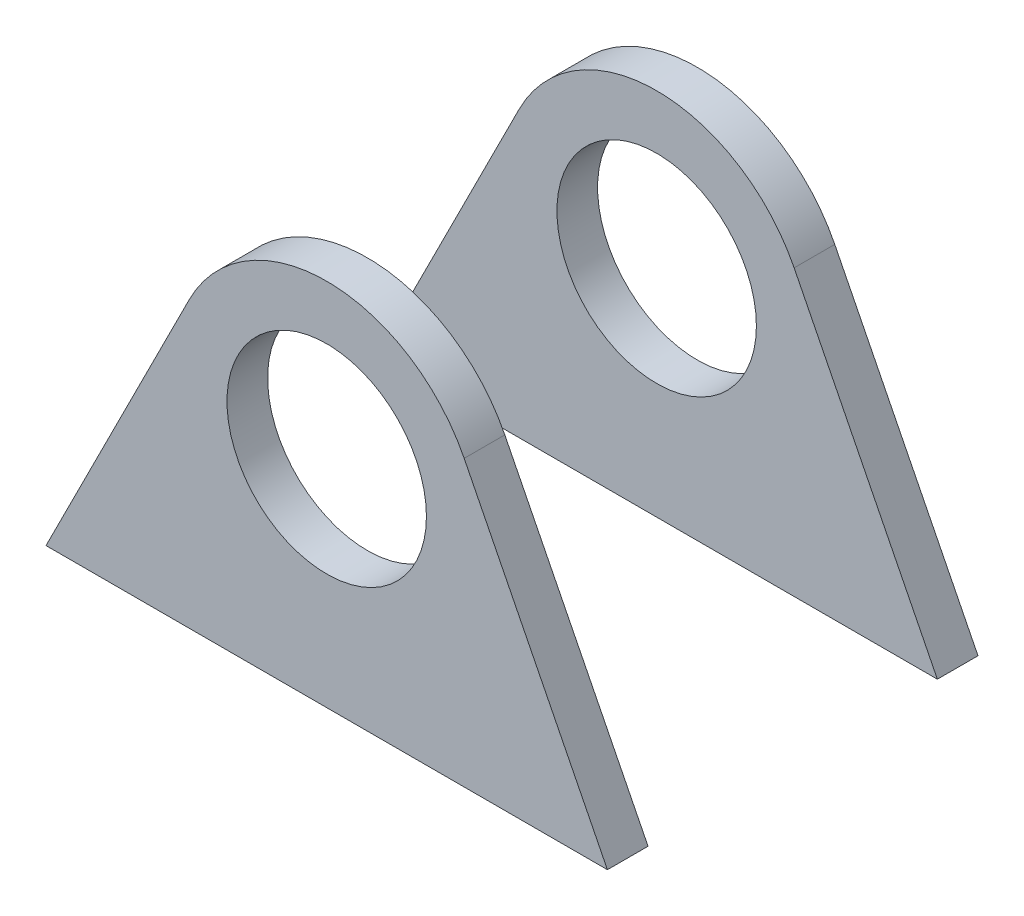
ISO-10303-21;
HEADER;
FILE_DESCRIPTION(('STEP AP214'),'2;1');
FILE_NAME('part.step','',(''),(''),'','','');
FILE_SCHEMA(('AUTOMOTIVE_DESIGN { 1 0 10303 214 1 1 1 1 }'));
ENDSEC;
DATA;
#1=APPLICATION_CONTEXT('core data for automotive mechanical design processes');
#2=APPLICATION_PROTOCOL_DEFINITION('international standard','automotive_design',2000,#1);
#3=PRODUCT_CONTEXT('',#1,'mechanical');
#4=PRODUCT('Part','Part','',(#3));
#5=PRODUCT_RELATED_PRODUCT_CATEGORY('part','',(#4));
#6=PRODUCT_DEFINITION_FORMATION('','',#4);
#7=PRODUCT_DEFINITION_CONTEXT('part definition',#1,'design');
#8=PRODUCT_DEFINITION('design','',#6,#7);
#9=PRODUCT_DEFINITION_SHAPE('','',#8);
#10=(LENGTH_UNIT() NAMED_UNIT(*) SI_UNIT(.MILLI.,.METRE.));
#11=(NAMED_UNIT(*) PLANE_ANGLE_UNIT() SI_UNIT($,.RADIAN.));
#12=(NAMED_UNIT(*) SI_UNIT($,.STERADIAN.) SOLID_ANGLE_UNIT());
#13=UNCERTAINTY_MEASURE_WITH_UNIT(LENGTH_MEASURE(1.E-05),#10,'distance_accuracy_value','');
#14=(GEOMETRIC_REPRESENTATION_CONTEXT(3) GLOBAL_UNCERTAINTY_ASSIGNED_CONTEXT((#13)) GLOBAL_UNIT_ASSIGNED_CONTEXT((#10,
#11,#12)) REPRESENTATION_CONTEXT('',''));
#15=CARTESIAN_POINT('',(0.,0.,0.));
#16=DIRECTION('',(0.,0.,1.));
#17=DIRECTION('',(1.,0.,0.));
#18=AXIS2_PLACEMENT_3D('',#15,#16,#17);
#19=CARTESIAN_POINT('',(0.,0.,26.8));
#20=DIRECTION('',(0.,0.,1.));
#21=DIRECTION('',(-1.,0.,0.));
#22=AXIS2_PLACEMENT_3D('',#19,#20,#21);
#23=PLANE('',#22);
#24=DIRECTION('',(-0.449518691350352,0.893270925378559,0.));
#25=VECTOR('',#24,1.);
#26=CARTESIAN_POINT('',(22.8,-17.5,26.8));
#27=LINE('',#26,#25);
#28=CARTESIAN_POINT('',(22.8,-17.5,26.8));
#29=VERTEX_POINT('',#28);
#30=CARTESIAN_POINT('',(11.165886567232,5.6189836418794,26.8));
#31=VERTEX_POINT('',#30);
#32=EDGE_CURVE('E101',#29,#31,#27,.T.);
#33=ORIENTED_EDGE('',*,*,#32,.F.);
#34=DIRECTION('',(1.,0.,0.));
#35=VECTOR('',#34,1.);
#36=CARTESIAN_POINT('',(-22.8,-17.5,26.8));
#37=LINE('',#36,#35);
#38=CARTESIAN_POINT('',(-22.8,-17.5,26.8));
#39=VERTEX_POINT('',#38);
#40=EDGE_CURVE('E104',#39,#29,#37,.T.);
#41=ORIENTED_EDGE('',*,*,#40,.F.);
#42=DIRECTION('',(-0.449518691350352,-0.893270925378559,0.));
#43=VECTOR('',#42,1.);
#44=CARTESIAN_POINT('',(-22.8,-17.5,26.8));
#45=LINE('',#44,#43);
#46=CARTESIAN_POINT('',(-11.165886567232,5.61898364187939,26.8));
#47=VERTEX_POINT('',#46);
#48=EDGE_CURVE('E92',#47,#39,#45,.T.);
#49=ORIENTED_EDGE('',*,*,#48,.F.);
#50=CARTESIAN_POINT('',(0.,0.,26.8));
#51=DIRECTION('',(0.,0.,1.));
#52=DIRECTION('',(-1.,0.,0.));
#53=AXIS2_PLACEMENT_3D('',#50,#51,#52);
#54=CIRCLE('',#53,12.5);
#55=EDGE_CURVE('E97',#31,#47,#54,.T.);
#56=ORIENTED_EDGE('',*,*,#55,.F.);
#57=EDGE_LOOP('',(#33,#41,#49,#56));
#58=FACE_BOUND('',#57,.T.);
#59=CARTESIAN_POINT('',(0.,0.,26.8));
#60=DIRECTION('',(0.,0.,1.));
#61=DIRECTION('',(1.,0.,0.));
#62=AXIS2_PLACEMENT_3D('',#59,#60,#61);
#63=CIRCLE('',#62,8.1);
#64=CARTESIAN_POINT('',(8.1,0.,26.8));
#65=VERTEX_POINT('',#64);
#66=EDGE_CURVE('E113',#65,#65,#63,.T.);
#67=ORIENTED_EDGE('',*,*,#66,.T.);
#68=EDGE_LOOP('',(#67));
#69=FACE_BOUND('',#68,.T.);
#70=ADVANCED_FACE('F45',(#58,#69),#23,.F.);
#71=CARTESIAN_POINT('',(0.,0.,30.1));
#72=DIRECTION('',(0.,0.,1.));
#73=DIRECTION('',(-1.,0.,0.));
#74=AXIS2_PLACEMENT_3D('',#71,#72,#73);
#75=PLANE('',#74);
#76=DIRECTION('',(-0.449518691350352,0.893270925378559,0.));
#77=VECTOR('',#76,1.);
#78=CARTESIAN_POINT('',(22.8,-17.5,30.1));
#79=LINE('',#78,#77);
#80=CARTESIAN_POINT('',(22.8,-17.5,30.1));
#81=VERTEX_POINT('',#80);
#82=CARTESIAN_POINT('',(11.165886567232,5.6189836418794,30.1));
#83=VERTEX_POINT('',#82);
#84=EDGE_CURVE('E109',#81,#83,#79,.T.);
#85=ORIENTED_EDGE('',*,*,#84,.T.);
#86=CARTESIAN_POINT('',(0.,0.,30.1));
#87=DIRECTION('',(0.,0.,1.));
#88=DIRECTION('',(-1.,0.,0.));
#89=AXIS2_PLACEMENT_3D('',#86,#87,#88);
#90=CIRCLE('',#89,12.5);
#91=CARTESIAN_POINT('',(-11.165886567232,5.61898364187939,30.1));
#92=VERTEX_POINT('',#91);
#93=EDGE_CURVE('E112',#83,#92,#90,.T.);
#94=ORIENTED_EDGE('',*,*,#93,.T.);
#95=DIRECTION('',(-0.449518691350352,-0.893270925378559,0.));
#96=VECTOR('',#95,1.);
#97=CARTESIAN_POINT('',(-22.8,-17.5,30.1));
#98=LINE('',#97,#96);
#99=CARTESIAN_POINT('',(-22.8,-17.5,30.1));
#100=VERTEX_POINT('',#99);
#101=EDGE_CURVE('E95',#92,#100,#98,.T.);
#102=ORIENTED_EDGE('',*,*,#101,.T.);
#103=DIRECTION('',(1.,0.,0.));
#104=VECTOR('',#103,1.);
#105=CARTESIAN_POINT('',(-22.8,-17.5,30.1));
#106=LINE('',#105,#104);
#107=EDGE_CURVE('E116',#100,#81,#106,.T.);
#108=ORIENTED_EDGE('',*,*,#107,.T.);
#109=EDGE_LOOP('',(#85,#94,#102,#108));
#110=FACE_BOUND('',#109,.T.);
#111=CARTESIAN_POINT('',(0.,0.,30.1));
#112=DIRECTION('',(0.,0.,1.));
#113=DIRECTION('',(1.,0.,0.));
#114=AXIS2_PLACEMENT_3D('',#111,#112,#113);
#115=CIRCLE('',#114,8.1);
#116=CARTESIAN_POINT('',(8.1,0.,30.1));
#117=VERTEX_POINT('',#116);
#118=EDGE_CURVE('E121',#117,#117,#115,.T.);
#119=ORIENTED_EDGE('',*,*,#118,.F.);
#120=EDGE_LOOP('',(#119));
#121=FACE_BOUND('',#120,.T.);
#122=ADVANCED_FACE('F134',(#110,#121),#75,.T.);
#123=CARTESIAN_POINT('',(22.8,-17.5,26.8));
#124=DIRECTION('',(-0.893270925378559,-0.449518691350352,0.));
#125=DIRECTION('',(0.449518691350352,-0.893270925378559,0.));
#126=AXIS2_PLACEMENT_3D('',#123,#124,#125);
#127=PLANE('',#126);
#128=ORIENTED_EDGE('',*,*,#84,.F.);
#129=DIRECTION('',(0.,0.,1.));
#130=VECTOR('',#129,1.);
#131=CARTESIAN_POINT('',(22.8,-17.5,26.8));
#132=LINE('',#131,#130);
#133=EDGE_CURVE('E62',#29,#81,#132,.T.);
#134=ORIENTED_EDGE('',*,*,#133,.F.);
#135=ORIENTED_EDGE('',*,*,#32,.T.);
#136=DIRECTION('',(0.,0.,1.));
#137=VECTOR('',#136,1.);
#138=CARTESIAN_POINT('',(11.165886567232,5.6189836418794,26.8));
#139=LINE('',#138,#137);
#140=EDGE_CURVE('E12',#31,#83,#139,.T.);
#141=ORIENTED_EDGE('',*,*,#140,.T.);
#142=EDGE_LOOP('',(#128,#134,#135,#141));
#143=FACE_BOUND('',#142,.T.);
#144=ADVANCED_FACE('F47',(#143),#127,.F.);
#145=CARTESIAN_POINT('',(0.,0.,26.8));
#146=DIRECTION('',(0.,0.,1.));
#147=DIRECTION('',(-1.,0.,0.));
#148=AXIS2_PLACEMENT_3D('',#145,#146,#147);
#149=CYLINDRICAL_SURFACE('',#148,12.5);
#150=ORIENTED_EDGE('',*,*,#93,.F.);
#151=ORIENTED_EDGE('',*,*,#140,.F.);
#152=ORIENTED_EDGE('',*,*,#55,.T.);
#153=DIRECTION('',(0.,0.,1.));
#154=VECTOR('',#153,1.);
#155=CARTESIAN_POINT('',(-11.165886567232,5.61898364187939,26.8));
#156=LINE('',#155,#154);
#157=EDGE_CURVE('E54',#47,#92,#156,.T.);
#158=ORIENTED_EDGE('',*,*,#157,.T.);
#159=EDGE_LOOP('',(#150,#151,#152,#158));
#160=FACE_BOUND('',#159,.T.);
#161=ADVANCED_FACE('F98',(#160),#149,.T.);
#162=CARTESIAN_POINT('',(-22.8,-17.5,26.8));
#163=DIRECTION('',(0.893270925378559,-0.449518691350352,0.));
#164=DIRECTION('',(0.449518691350352,0.893270925378559,0.));
#165=AXIS2_PLACEMENT_3D('',#162,#163,#164);
#166=PLANE('',#165);
#167=ORIENTED_EDGE('',*,*,#101,.F.);
#168=ORIENTED_EDGE('',*,*,#157,.F.);
#169=ORIENTED_EDGE('',*,*,#48,.T.);
#170=DIRECTION('',(0.,0.,1.));
#171=VECTOR('',#170,1.);
#172=CARTESIAN_POINT('',(-22.8,-17.5,26.8));
#173=LINE('',#172,#171);
#174=EDGE_CURVE('E78',#39,#100,#173,.T.);
#175=ORIENTED_EDGE('',*,*,#174,.T.);
#176=EDGE_LOOP('',(#167,#168,#169,#175));
#177=FACE_BOUND('',#176,.T.);
#178=ADVANCED_FACE('F90',(#177),#166,.F.);
#179=CARTESIAN_POINT('',(-22.8,-17.5,26.8));
#180=DIRECTION('',(0.,1.,0.));
#181=DIRECTION('',(0.,0.,-1.));
#182=AXIS2_PLACEMENT_3D('',#179,#180,#181);
#183=PLANE('',#182);
#184=ORIENTED_EDGE('',*,*,#107,.F.);
#185=ORIENTED_EDGE('',*,*,#174,.F.);
#186=ORIENTED_EDGE('',*,*,#40,.T.);
#187=ORIENTED_EDGE('',*,*,#133,.T.);
#188=EDGE_LOOP('',(#184,#185,#186,#187));
#189=FACE_BOUND('',#188,.T.);
#190=ADVANCED_FACE('F130',(#189),#183,.F.);
#191=CARTESIAN_POINT('',(0.,0.,26.8));
#192=DIRECTION('',(0.,0.,1.));
#193=DIRECTION('',(-1.,0.,0.));
#194=AXIS2_PLACEMENT_3D('',#191,#192,#193);
#195=CYLINDRICAL_SURFACE('',#194,8.1);
#196=ORIENTED_EDGE('',*,*,#66,.F.);
#197=EDGE_LOOP('',(#196));
#198=FACE_BOUND('',#197,.T.);
#199=ORIENTED_EDGE('',*,*,#118,.T.);
#200=EDGE_LOOP('',(#199));
#201=FACE_BOUND('',#200,.T.);
#202=ADVANCED_FACE('F127',(#198,#201),#195,.F.);
#203=CLOSED_SHELL('',(#70,#122,#144,#161,#178,#190,#202));
#204=MANIFOLD_SOLID_BREP('B2',#203);
#205=CARTESIAN_POINT('',(0.,0.,3.3));
#206=DIRECTION('',(0.,0.,-1.));
#207=DIRECTION('',(-1.,0.,0.));
#208=AXIS2_PLACEMENT_3D('',#205,#206,#207);
#209=PLANE('',#208);
#210=DIRECTION('',(-0.449518691350352,0.893270925378559,0.));
#211=VECTOR('',#210,1.);
#212=CARTESIAN_POINT('',(22.8,-17.5,3.3));
#213=LINE('',#212,#211);
#214=CARTESIAN_POINT('',(22.8,-17.5,3.3));
#215=VERTEX_POINT('',#214);
#216=CARTESIAN_POINT('',(11.165886567232,5.6189836418794,3.3));
#217=VERTEX_POINT('',#216);
#218=EDGE_CURVE('E242',#215,#217,#213,.T.);
#219=ORIENTED_EDGE('',*,*,#218,.T.);
#220=CARTESIAN_POINT('',(0.,0.,3.3));
#221=DIRECTION('',(0.,0.,1.));
#222=DIRECTION('',(-1.,0.,0.));
#223=AXIS2_PLACEMENT_3D('',#220,#221,#222);
#224=CIRCLE('',#223,12.5);
#225=CARTESIAN_POINT('',(-11.165886567232,5.61898364187939,3.3));
#226=VERTEX_POINT('',#225);
#227=EDGE_CURVE('E237',#217,#226,#224,.T.);
#228=ORIENTED_EDGE('',*,*,#227,.T.);
#229=DIRECTION('',(-0.449518691350352,-0.893270925378559,0.));
#230=VECTOR('',#229,1.);
#231=CARTESIAN_POINT('',(-22.8,-17.5,3.3));
#232=LINE('',#231,#230);
#233=CARTESIAN_POINT('',(-22.8,-17.5,3.3));
#234=VERTEX_POINT('',#233);
#235=EDGE_CURVE('E240',#226,#234,#232,.T.);
#236=ORIENTED_EDGE('',*,*,#235,.T.);
#237=DIRECTION('',(1.,0.,0.));
#238=VECTOR('',#237,1.);
#239=CARTESIAN_POINT('',(-22.8,-17.5,3.3));
#240=LINE('',#239,#238);
#241=EDGE_CURVE('E207',#234,#215,#240,.T.);
#242=ORIENTED_EDGE('',*,*,#241,.T.);
#243=EDGE_LOOP('',(#219,#228,#236,#242));
#244=FACE_BOUND('',#243,.T.);
#245=CARTESIAN_POINT('',(0.,0.,3.3));
#246=DIRECTION('',(0.,0.,1.));
#247=DIRECTION('',(1.,0.,0.));
#248=AXIS2_PLACEMENT_3D('',#245,#246,#247);
#249=CIRCLE('',#248,8.1);
#250=CARTESIAN_POINT('',(8.1,0.,3.3));
#251=VERTEX_POINT('',#250);
#252=EDGE_CURVE('E257',#251,#251,#249,.T.);
#253=ORIENTED_EDGE('',*,*,#252,.F.);
#254=EDGE_LOOP('',(#253));
#255=FACE_BOUND('',#254,.T.);
#256=ADVANCED_FACE('F190',(#244,#255),#209,.F.);
#257=CARTESIAN_POINT('',(0.,0.,0.));
#258=DIRECTION('',(0.,0.,-1.));
#259=DIRECTION('',(-1.,0.,0.));
#260=AXIS2_PLACEMENT_3D('',#257,#258,#259);
#261=PLANE('',#260);
#262=DIRECTION('',(-0.449518691350352,0.893270925378559,0.));
#263=VECTOR('',#262,1.);
#264=CARTESIAN_POINT('',(22.8,-17.5,0.));
#265=LINE('',#264,#263);
#266=CARTESIAN_POINT('',(22.8,-17.5,0.));
#267=VERTEX_POINT('',#266);
#268=CARTESIAN_POINT('',(11.165886567232,5.6189836418794,0.));
#269=VERTEX_POINT('',#268);
#270=EDGE_CURVE('E254',#267,#269,#265,.T.);
#271=ORIENTED_EDGE('',*,*,#270,.F.);
#272=DIRECTION('',(1.,0.,0.));
#273=VECTOR('',#272,1.);
#274=CARTESIAN_POINT('',(-22.8,-17.5,0.));
#275=LINE('',#274,#273);
#276=CARTESIAN_POINT('',(-22.8,-17.5,0.));
#277=VERTEX_POINT('',#276);
#278=EDGE_CURVE('E230',#277,#267,#275,.T.);
#279=ORIENTED_EDGE('',*,*,#278,.F.);
#280=DIRECTION('',(-0.449518691350352,-0.893270925378559,0.));
#281=VECTOR('',#280,1.);
#282=CARTESIAN_POINT('',(-22.8,-17.5,0.));
#283=LINE('',#282,#281);
#284=CARTESIAN_POINT('',(-11.165886567232,5.61898364187939,0.));
#285=VERTEX_POINT('',#284);
#286=EDGE_CURVE('E224',#285,#277,#283,.T.);
#287=ORIENTED_EDGE('',*,*,#286,.F.);
#288=CARTESIAN_POINT('',(0.,0.,0.));
#289=DIRECTION('',(0.,0.,1.));
#290=DIRECTION('',(-1.,0.,0.));
#291=AXIS2_PLACEMENT_3D('',#288,#289,#290);
#292=CIRCLE('',#291,12.5);
#293=EDGE_CURVE('E246',#269,#285,#292,.T.);
#294=ORIENTED_EDGE('',*,*,#293,.F.);
#295=EDGE_LOOP('',(#271,#279,#287,#294));
#296=FACE_BOUND('',#295,.T.);
#297=CARTESIAN_POINT('',(0.,0.,0.));
#298=DIRECTION('',(0.,0.,1.));
#299=DIRECTION('',(1.,0.,0.));
#300=AXIS2_PLACEMENT_3D('',#297,#298,#299);
#301=CIRCLE('',#300,8.1);
#302=CARTESIAN_POINT('',(8.1,0.,0.));
#303=VERTEX_POINT('',#302);
#304=EDGE_CURVE('E269',#303,#303,#301,.T.);
#305=ORIENTED_EDGE('',*,*,#304,.T.);
#306=EDGE_LOOP('',(#305));
#307=FACE_BOUND('',#306,.T.);
#308=ADVANCED_FACE('F265',(#296,#307),#261,.T.);
#309=CARTESIAN_POINT('',(22.8,-17.5,3.3));
#310=DIRECTION('',(-0.893270925378559,-0.449518691350352,0.));
#311=DIRECTION('',(0.449518691350352,-0.893270925378559,0.));
#312=AXIS2_PLACEMENT_3D('',#309,#310,#311);
#313=PLANE('',#312);
#314=ORIENTED_EDGE('',*,*,#270,.T.);
#315=DIRECTION('',(0.,0.,-1.));
#316=VECTOR('',#315,1.);
#317=CARTESIAN_POINT('',(11.165886567232,5.6189836418794,3.3));
#318=LINE('',#317,#316);
#319=EDGE_CURVE('E43',#217,#269,#318,.T.);
#320=ORIENTED_EDGE('',*,*,#319,.F.);
#321=ORIENTED_EDGE('',*,*,#218,.F.);
#322=DIRECTION('',(0.,0.,-1.));
#323=VECTOR('',#322,1.);
#324=CARTESIAN_POINT('',(22.8,-17.5,3.3));
#325=LINE('',#324,#323);
#326=EDGE_CURVE('E250',#215,#267,#325,.T.);
#327=ORIENTED_EDGE('',*,*,#326,.T.);
#328=EDGE_LOOP('',(#314,#320,#321,#327));
#329=FACE_BOUND('',#328,.T.);
#330=ADVANCED_FACE('F192',(#329),#313,.F.);
#331=CARTESIAN_POINT('',(0.,0.,3.3));
#332=DIRECTION('',(0.,0.,-1.));
#333=DIRECTION('',(-1.,0.,0.));
#334=AXIS2_PLACEMENT_3D('',#331,#332,#333);
#335=CYLINDRICAL_SURFACE('',#334,12.5);
#336=ORIENTED_EDGE('',*,*,#293,.T.);
#337=DIRECTION('',(0.,0.,-1.));
#338=VECTOR('',#337,1.);
#339=CARTESIAN_POINT('',(-11.165886567232,5.61898364187939,3.3));
#340=LINE('',#339,#338);
#341=EDGE_CURVE('E199',#226,#285,#340,.T.);
#342=ORIENTED_EDGE('',*,*,#341,.F.);
#343=ORIENTED_EDGE('',*,*,#227,.F.);
#344=ORIENTED_EDGE('',*,*,#319,.T.);
#345=EDGE_LOOP('',(#336,#342,#343,#344));
#346=FACE_BOUND('',#345,.T.);
#347=ADVANCED_FACE('F245',(#346),#335,.T.);
#348=CARTESIAN_POINT('',(-22.8,-17.5,3.3));
#349=DIRECTION('',(0.893270925378559,-0.449518691350352,0.));
#350=DIRECTION('',(0.449518691350352,0.893270925378559,0.));
#351=AXIS2_PLACEMENT_3D('',#348,#349,#350);
#352=PLANE('',#351);
#353=ORIENTED_EDGE('',*,*,#286,.T.);
#354=DIRECTION('',(0.,0.,-1.));
#355=VECTOR('',#354,1.);
#356=CARTESIAN_POINT('',(-22.8,-17.5,3.3));
#357=LINE('',#356,#355);
#358=EDGE_CURVE('E247',#234,#277,#357,.T.);
#359=ORIENTED_EDGE('',*,*,#358,.F.);
#360=ORIENTED_EDGE('',*,*,#235,.F.);
#361=ORIENTED_EDGE('',*,*,#341,.T.);
#362=EDGE_LOOP('',(#353,#359,#360,#361));
#363=FACE_BOUND('',#362,.T.);
#364=ADVANCED_FACE('F248',(#363),#352,.F.);
#365=CARTESIAN_POINT('',(-22.8,-17.5,3.3));
#366=DIRECTION('',(0.,1.,0.));
#367=DIRECTION('',(0.,0.,1.));
#368=AXIS2_PLACEMENT_3D('',#365,#366,#367);
#369=PLANE('',#368);
#370=ORIENTED_EDGE('',*,*,#278,.T.);
#371=ORIENTED_EDGE('',*,*,#326,.F.);
#372=ORIENTED_EDGE('',*,*,#241,.F.);
#373=ORIENTED_EDGE('',*,*,#358,.T.);
#374=EDGE_LOOP('',(#370,#371,#372,#373));
#375=FACE_BOUND('',#374,.T.);
#376=ADVANCED_FACE('F262',(#375),#369,.F.);
#377=CARTESIAN_POINT('',(0.,0.,3.3));
#378=DIRECTION('',(0.,0.,-1.));
#379=DIRECTION('',(-1.,0.,0.));
#380=AXIS2_PLACEMENT_3D('',#377,#378,#379);
#381=CYLINDRICAL_SURFACE('',#380,8.1);
#382=ORIENTED_EDGE('',*,*,#252,.T.);
#383=EDGE_LOOP('',(#382));
#384=FACE_BOUND('',#383,.T.);
#385=ORIENTED_EDGE('',*,*,#304,.F.);
#386=EDGE_LOOP('',(#385));
#387=FACE_BOUND('',#386,.T.);
#388=ADVANCED_FACE('F275',(#384,#387),#381,.F.);
#389=CLOSED_SHELL('',(#256,#308,#330,#347,#364,#376,#388));
#390=MANIFOLD_SOLID_BREP('B6',#389);
#391=ADVANCED_BREP_SHAPE_REPRESENTATION('',(#18,#204,#390),#14);
#392=SHAPE_DEFINITION_REPRESENTATION(#9,#391);
ENDSEC;
END-ISO-10303-21;
